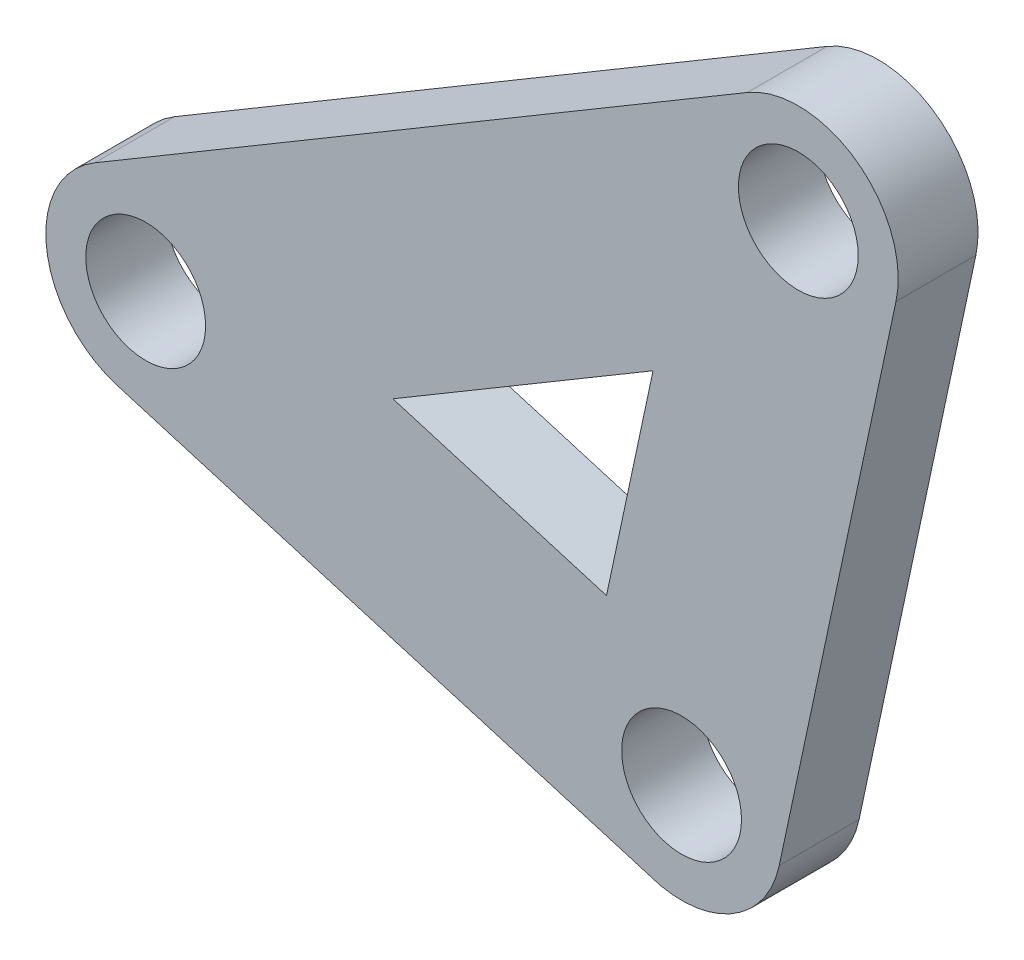
ISO-10303-21;
HEADER;
FILE_DESCRIPTION(('STEP AP214'),'2;1');
FILE_NAME('part.step','',(''),(''),'','','');
FILE_SCHEMA(('AUTOMOTIVE_DESIGN { 1 0 10303 214 1 1 1 1 }'));
ENDSEC;
DATA;
#1=APPLICATION_CONTEXT('core data for automotive mechanical design processes');
#2=APPLICATION_PROTOCOL_DEFINITION('international standard','automotive_design',2000,#1);
#3=PRODUCT_CONTEXT('',#1,'mechanical');
#4=PRODUCT('Part','Part','',(#3));
#5=PRODUCT_RELATED_PRODUCT_CATEGORY('part','',(#4));
#6=PRODUCT_DEFINITION_FORMATION('','',#4);
#7=PRODUCT_DEFINITION_CONTEXT('part definition',#1,'design');
#8=PRODUCT_DEFINITION('design','',#6,#7);
#9=PRODUCT_DEFINITION_SHAPE('','',#8);
#10=(LENGTH_UNIT() NAMED_UNIT(*) SI_UNIT(.MILLI.,.METRE.));
#11=(NAMED_UNIT(*) PLANE_ANGLE_UNIT() SI_UNIT($,.RADIAN.));
#12=(NAMED_UNIT(*) SI_UNIT($,.STERADIAN.) SOLID_ANGLE_UNIT());
#13=UNCERTAINTY_MEASURE_WITH_UNIT(LENGTH_MEASURE(1.E-05),#10,'distance_accuracy_value','');
#14=(GEOMETRIC_REPRESENTATION_CONTEXT(3) GLOBAL_UNCERTAINTY_ASSIGNED_CONTEXT((#13)) GLOBAL_UNIT_ASSIGNED_CONTEXT((#10,
#11,#12)) REPRESENTATION_CONTEXT('',''));
#15=CARTESIAN_POINT('',(0.,0.,0.));
#16=DIRECTION('',(0.,0.,1.));
#17=DIRECTION('',(1.,0.,0.));
#18=AXIS2_PLACEMENT_3D('',#15,#16,#17);
#19=CARTESIAN_POINT('',(-17.5433301886553,3.74516692806603,-2.));
#20=DIRECTION('',(0.977963368191997,-0.208776556333713,0.));
#21=DIRECTION('',(0.208776556333713,0.977963368191997,0.));
#22=AXIS2_PLACEMENT_3D('',#19,#20,#21);
#23=PLANE('',#22);
#24=DIRECTION('',(0.208776556333713,0.977963368191997,0.));
#25=VECTOR('',#24,1.);
#26=CARTESIAN_POINT('',(-17.5433301886553,3.74516692806603,0.));
#27=LINE('',#26,#25);
#28=CARTESIAN_POINT('',(-17.8799215946043,2.16848575826948,0.));
#29=VERTEX_POINT('',#28);
#30=CARTESIAN_POINT('',(-16.7147865975456,7.62627932538128,0.));
#31=VERTEX_POINT('',#30);
#32=EDGE_CURVE('E159',#29,#31,#27,.T.);
#33=ORIENTED_EDGE('',*,*,#32,.T.);
#34=DIRECTION('',(0.,0.,1.));
#35=VECTOR('',#34,1.);
#36=CARTESIAN_POINT('',(-16.7147865975456,7.62627932538128,-2.));
#37=LINE('',#36,#35);
#38=CARTESIAN_POINT('',(-16.7147865975456,7.62627932538128,-2.));
#39=VERTEX_POINT('',#38);
#40=EDGE_CURVE('E11',#39,#31,#37,.T.);
#41=ORIENTED_EDGE('',*,*,#40,.F.);
#42=DIRECTION('',(0.208776556333713,0.977963368191997,0.));
#43=VECTOR('',#42,1.);
#44=CARTESIAN_POINT('',(-17.5433301886553,3.74516692806603,-2.));
#45=LINE('',#44,#43);
#46=CARTESIAN_POINT('',(-17.8799215946043,2.16848575826948,-2.));
#47=VERTEX_POINT('',#46);
#48=EDGE_CURVE('E120',#47,#39,#45,.T.);
#49=ORIENTED_EDGE('',*,*,#48,.F.);
#50=DIRECTION('',(0.,0.,1.));
#51=VECTOR('',#50,1.);
#52=CARTESIAN_POINT('',(-17.8799215946043,2.16848575826948,-2.));
#53=LINE('',#52,#51);
#54=EDGE_CURVE('E125',#47,#29,#53,.T.);
#55=ORIENTED_EDGE('',*,*,#54,.T.);
#56=EDGE_LOOP('',(#33,#41,#49,#55));
#57=FACE_BOUND('',#56,.T.);
#58=ADVANCED_FACE('F39',(#57),#23,.F.);
#59=CARTESIAN_POINT('',(-7.6987142658417,12.9756829105631,-2.));
#60=DIRECTION('',(-0.510264432821165,0.860017562958859,0.));
#61=DIRECTION('',(-0.860017562958859,-0.510264432821165,0.));
#62=AXIS2_PLACEMENT_3D('',#59,#60,#61);
#63=PLANE('',#62);
#64=DIRECTION('',(-0.860017562958859,-0.510264432821165,0.));
#65=VECTOR('',#64,1.);
#66=CARTESIAN_POINT('',(-7.6987142658417,12.9756829105631,0.));
#67=LINE('',#66,#65);
#68=CARTESIAN_POINT('',(-23.2284813572229,3.76158294559823,0.));
#69=VERTEX_POINT('',#68);
#70=EDGE_CURVE('E86',#31,#69,#67,.T.);
#71=ORIENTED_EDGE('',*,*,#70,.T.);
#72=DIRECTION('',(0.,0.,1.));
#73=VECTOR('',#72,1.);
#74=CARTESIAN_POINT('',(-23.2284813572229,3.76158294559823,-2.));
#75=LINE('',#74,#73);
#76=CARTESIAN_POINT('',(-23.2284813572229,3.76158294559823,-2.));
#77=VERTEX_POINT('',#76);
#78=EDGE_CURVE('E49',#77,#69,#75,.T.);
#79=ORIENTED_EDGE('',*,*,#78,.F.);
#80=DIRECTION('',(-0.860017562958859,-0.510264432821165,0.));
#81=VECTOR('',#80,1.);
#82=CARTESIAN_POINT('',(-7.6987142658417,12.9756829105631,-2.));
#83=LINE('',#82,#81);
#84=EDGE_CURVE('E57',#39,#77,#83,.T.);
#85=ORIENTED_EDGE('',*,*,#84,.F.);
#86=ORIENTED_EDGE('',*,*,#40,.T.);
#87=EDGE_LOOP('',(#71,#79,#85,#86));
#88=FACE_BOUND('',#87,.T.);
#89=ADVANCED_FACE('F217',(#88),#63,.F.);
#90=CARTESIAN_POINT('',(-2.28224422330199,-7.6777304514016,-2.));
#91=DIRECTION('',(-0.284933068933284,-0.958547414700108,0.));
#92=DIRECTION('',(0.958547414700108,-0.284933068933284,0.));
#93=AXIS2_PLACEMENT_3D('',#90,#91,#92);
#94=PLANE('',#93);
#95=DIRECTION('',(0.958547414700108,-0.284933068933284,0.));
#96=VECTOR('',#95,1.);
#97=CARTESIAN_POINT('',(-2.28224422330199,-7.6777304514016,0.));
#98=LINE('',#97,#96);
#99=CARTESIAN_POINT('',(-30.1311160023831,0.600487590452555,0.));
#100=VERTEX_POINT('',#99);
#101=CARTESIAN_POINT('',(-16.5219413908343,-3.44490842048,0.));
#102=VERTEX_POINT('',#101);
#103=EDGE_CURVE('E140',#100,#102,#98,.T.);
#104=ORIENTED_EDGE('',*,*,#103,.F.);
#105=DIRECTION('',(0.,0.,1.));
#106=VECTOR('',#105,1.);
#107=CARTESIAN_POINT('',(-30.1311160023831,0.600487590452555,-2.));
#108=LINE('',#107,#106);
#109=CARTESIAN_POINT('',(-30.1311160023831,0.600487590452555,-2.));
#110=VERTEX_POINT('',#109);
#111=EDGE_CURVE('E130',#110,#100,#108,.T.);
#112=ORIENTED_EDGE('',*,*,#111,.F.);
#113=DIRECTION('',(0.958547414700108,-0.284933068933284,0.));
#114=VECTOR('',#113,1.);
#115=CARTESIAN_POINT('',(-2.28224422330199,-7.6777304514016,-2.));
#116=LINE('',#115,#114);
#117=CARTESIAN_POINT('',(-16.5219413908343,-3.44490842048,-2.));
#118=VERTEX_POINT('',#117);
#119=EDGE_CURVE('E162',#110,#118,#116,.T.);
#120=ORIENTED_EDGE('',*,*,#119,.T.);
#121=DIRECTION('',(0.,0.,1.));
#122=VECTOR('',#121,1.);
#123=CARTESIAN_POINT('',(-16.5219413908343,-3.44490842048,-2.));
#124=LINE('',#123,#122);
#125=EDGE_CURVE('E43',#118,#102,#124,.T.);
#126=ORIENTED_EDGE('',*,*,#125,.T.);
#127=EDGE_LOOP('',(#104,#112,#120,#126));
#128=FACE_BOUND('',#127,.T.);
#129=ADVANCED_FACE('F41',(#128),#94,.T.);
#130=CARTESIAN_POINT('',(-29.4174619075463,2.99646293108583,-2.));
#131=DIRECTION('',(0.,0.,1.));
#132=DIRECTION('',(1.,0.,0.));
#133=AXIS2_PLACEMENT_3D('',#130,#131,#132);
#134=CYLINDRICAL_SURFACE('',#133,2.5);
#135=CARTESIAN_POINT('',(-29.4174619075463,2.99646293108583,0.));
#136=DIRECTION('',(0.,0.,1.));
#137=DIRECTION('',(1.,0.,0.));
#138=AXIS2_PLACEMENT_3D('',#135,#136,#137);
#139=CIRCLE('',#138,2.5);
#140=CARTESIAN_POINT('',(-30.6931229895992,5.14650683848299,0.));
#141=VERTEX_POINT('',#140);
#142=EDGE_CURVE('E156',#141,#100,#139,.T.);
#143=ORIENTED_EDGE('',*,*,#142,.F.);
#144=DIRECTION('',(0.,0.,1.));
#145=VECTOR('',#144,1.);
#146=CARTESIAN_POINT('',(-30.6931229895992,5.14650683848299,-2.));
#147=LINE('',#146,#145);
#148=CARTESIAN_POINT('',(-30.6931229895992,5.14650683848299,-2.));
#149=VERTEX_POINT('',#148);
#150=EDGE_CURVE('E166',#149,#141,#147,.T.);
#151=ORIENTED_EDGE('',*,*,#150,.F.);
#152=CARTESIAN_POINT('',(-29.4174619075463,2.99646293108583,-2.));
#153=DIRECTION('',(0.,0.,1.));
#154=DIRECTION('',(1.,0.,0.));
#155=AXIS2_PLACEMENT_3D('',#152,#153,#154);
#156=CIRCLE('',#155,2.5);
#157=EDGE_CURVE('E132',#149,#110,#156,.T.);
#158=ORIENTED_EDGE('',*,*,#157,.T.);
#159=ORIENTED_EDGE('',*,*,#111,.T.);
#160=EDGE_LOOP('',(#143,#151,#158,#159));
#161=FACE_BOUND('',#160,.T.);
#162=ADVANCED_FACE('F183',(#161),#134,.T.);
#163=CARTESIAN_POINT('',(-10.2500364299475,17.2757707253574,-2.));
#164=DIRECTION('',(-0.510264432821165,0.860017562958859,0.));
#165=DIRECTION('',(-0.860017562958859,-0.510264432821165,0.));
#166=AXIS2_PLACEMENT_3D('',#163,#164,#165);
#167=PLANE('',#166);
#168=DIRECTION('',(-0.860017562958859,-0.510264432821165,0.));
#169=VECTOR('',#168,1.);
#170=CARTESIAN_POINT('',(-10.2500364299475,17.2757707253574,0.));
#171=LINE('',#170,#169);
#172=CARTESIAN_POINT('',(-14.3527892933809,14.8415310620851,0.));
#173=VERTEX_POINT('',#172);
#174=EDGE_CURVE('E153',#173,#141,#171,.T.);
#175=ORIENTED_EDGE('',*,*,#174,.F.);
#176=DIRECTION('',(0.,0.,1.));
#177=VECTOR('',#176,1.);
#178=CARTESIAN_POINT('',(-14.3527892933809,14.8415310620851,-2.));
#179=LINE('',#178,#177);
#180=CARTESIAN_POINT('',(-14.3527892933809,14.8415310620851,-2.));
#181=VERTEX_POINT('',#180);
#182=EDGE_CURVE('E168',#181,#173,#179,.T.);
#183=ORIENTED_EDGE('',*,*,#182,.F.);
#184=DIRECTION('',(-0.860017562958859,-0.510264432821165,0.));
#185=VECTOR('',#184,1.);
#186=CARTESIAN_POINT('',(-10.2500364299475,17.2757707253574,-2.));
#187=LINE('',#186,#185);
#188=EDGE_CURVE('E135',#181,#149,#187,.T.);
#189=ORIENTED_EDGE('',*,*,#188,.T.);
#190=ORIENTED_EDGE('',*,*,#150,.T.);
#191=EDGE_LOOP('',(#175,#183,#189,#190));
#192=FACE_BOUND('',#191,.T.);
#193=ADVANCED_FACE('F202',(#192),#167,.T.);
#194=CARTESIAN_POINT('',(-13.077128211328,12.691487154688,-2.));
#195=DIRECTION('',(0.,0.,1.));
#196=DIRECTION('',(1.,0.,0.));
#197=AXIS2_PLACEMENT_3D('',#194,#195,#196);
#198=CYLINDRICAL_SURFACE('',#197,2.5);
#199=CARTESIAN_POINT('',(-13.077128211328,12.691487154688,0.));
#200=DIRECTION('',(0.,0.,1.));
#201=DIRECTION('',(1.,0.,0.));
#202=AXIS2_PLACEMENT_3D('',#199,#200,#201);
#203=CIRCLE('',#202,2.5);
#204=CARTESIAN_POINT('',(-10.632219790848,12.1695457638537,0.));
#205=VERTEX_POINT('',#204);
#206=EDGE_CURVE('E150',#205,#173,#203,.T.);
#207=ORIENTED_EDGE('',*,*,#206,.F.);
#208=DIRECTION('',(0.,0.,1.));
#209=VECTOR('',#208,1.);
#210=CARTESIAN_POINT('',(-10.632219790848,12.1695457638537,-2.));
#211=LINE('',#210,#209);
#212=CARTESIAN_POINT('',(-10.632219790848,12.1695457638537,-2.));
#213=VERTEX_POINT('',#212);
#214=EDGE_CURVE('E170',#213,#205,#211,.T.);
#215=ORIENTED_EDGE('',*,*,#214,.F.);
#216=CARTESIAN_POINT('',(-13.077128211328,12.691487154688,-2.));
#217=DIRECTION('',(0.,0.,1.));
#218=DIRECTION('',(1.,0.,0.));
#219=AXIS2_PLACEMENT_3D('',#216,#217,#218);
#220=CIRCLE('',#219,2.5);
#221=EDGE_CURVE('E199',#213,#181,#220,.T.);
#222=ORIENTED_EDGE('',*,*,#221,.T.);
#223=ORIENTED_EDGE('',*,*,#182,.T.);
#224=EDGE_LOOP('',(#207,#215,#222,#223));
#225=FACE_BOUND('',#224,.T.);
#226=ADVANCED_FACE('F206',(#225),#198,.T.);
#227=CARTESIAN_POINT('',(-12.6535133476953,2.70128414639748,-2.));
#228=DIRECTION('',(0.977963368191997,-0.208776556333714,0.));
#229=DIRECTION('',(0.208776556333714,0.977963368191997,0.));
#230=AXIS2_PLACEMENT_3D('',#227,#228,#229);
#231=PLANE('',#230);
#232=DIRECTION('',(0.208776556333714,0.977963368191997,0.));
#233=VECTOR('',#232,1.);
#234=CARTESIAN_POINT('',(-12.6535133476953,2.70128414639748,0.));
#235=LINE('',#234,#233);
#236=CARTESIAN_POINT('',(-13.55509157952,-1.52194139083429,0.));
#237=VERTEX_POINT('',#236);
#238=EDGE_CURVE('E147',#237,#205,#235,.T.);
#239=ORIENTED_EDGE('',*,*,#238,.F.);
#240=DIRECTION('',(0.,0.,1.));
#241=VECTOR('',#240,1.);
#242=CARTESIAN_POINT('',(-13.55509157952,-1.52194139083429,-2.));
#243=LINE('',#242,#241);
#244=CARTESIAN_POINT('',(-13.55509157952,-1.52194139083429,-2.));
#245=VERTEX_POINT('',#244);
#246=EDGE_CURVE('E171',#245,#237,#243,.T.);
#247=ORIENTED_EDGE('',*,*,#246,.F.);
#248=DIRECTION('',(0.208776556333714,0.977963368191997,0.));
#249=VECTOR('',#248,1.);
#250=CARTESIAN_POINT('',(-12.6535133476953,2.70128414639748,-2.));
#251=LINE('',#250,#249);
#252=EDGE_CURVE('E191',#245,#213,#251,.T.);
#253=ORIENTED_EDGE('',*,*,#252,.T.);
#254=ORIENTED_EDGE('',*,*,#214,.T.);
#255=EDGE_LOOP('',(#239,#247,#253,#254));
#256=FACE_BOUND('',#255,.T.);
#257=ADVANCED_FACE('F208',(#256),#231,.T.);
#258=CARTESIAN_POINT('',(-16.,-1.,-2.));
#259=DIRECTION('',(0.,0.,1.));
#260=DIRECTION('',(1.,0.,0.));
#261=AXIS2_PLACEMENT_3D('',#258,#259,#260);
#262=CYLINDRICAL_SURFACE('',#261,2.5);
#263=CARTESIAN_POINT('',(-16.,-1.,0.));
#264=DIRECTION('',(0.,0.,1.));
#265=DIRECTION('',(1.,0.,0.));
#266=AXIS2_PLACEMENT_3D('',#263,#264,#265);
#267=CIRCLE('',#266,2.5);
#268=EDGE_CURVE('E143',#102,#237,#267,.T.);
#269=ORIENTED_EDGE('',*,*,#268,.F.);
#270=ORIENTED_EDGE('',*,*,#125,.F.);
#271=CARTESIAN_POINT('',(-16.,-1.,-2.));
#272=DIRECTION('',(0.,0.,1.));
#273=DIRECTION('',(1.,0.,0.));
#274=AXIS2_PLACEMENT_3D('',#271,#272,#273);
#275=CIRCLE('',#274,2.5);
#276=EDGE_CURVE('E189',#118,#245,#275,.T.);
#277=ORIENTED_EDGE('',*,*,#276,.T.);
#278=ORIENTED_EDGE('',*,*,#246,.T.);
#279=EDGE_LOOP('',(#269,#270,#277,#278));
#280=FACE_BOUND('',#279,.T.);
#281=ADVANCED_FACE('F177',(#280),#262,.T.);
#282=CARTESIAN_POINT('',(-0.863743070956386,-2.89987420183968,-2.));
#283=DIRECTION('',(-0.285461637934702,-0.958390136253309,0.));
#284=DIRECTION('',(0.958390136253309,-0.285461637934702,0.));
#285=AXIS2_PLACEMENT_3D('',#282,#283,#284);
#286=PLANE('',#285);
#287=DIRECTION('',(0.958390136253309,-0.285461637934702,0.));
#288=VECTOR('',#287,1.);
#289=CARTESIAN_POINT('',(-0.863743070956386,-2.89987420183968,0.));
#290=LINE('',#289,#288);
#291=EDGE_CURVE('E127',#69,#29,#290,.T.);
#292=ORIENTED_EDGE('',*,*,#291,.T.);
#293=ORIENTED_EDGE('',*,*,#54,.F.);
#294=DIRECTION('',(0.958390136253309,-0.285461637934702,0.));
#295=VECTOR('',#294,1.);
#296=CARTESIAN_POINT('',(-0.863743070956386,-2.89987420183968,-2.));
#297=LINE('',#296,#295);
#298=EDGE_CURVE('E116',#77,#47,#297,.T.);
#299=ORIENTED_EDGE('',*,*,#298,.F.);
#300=ORIENTED_EDGE('',*,*,#78,.T.);
#301=EDGE_LOOP('',(#292,#293,#299,#300));
#302=FACE_BOUND('',#301,.T.);
#303=ADVANCED_FACE('F126',(#302),#286,.F.);
#304=CARTESIAN_POINT('',(0.,0.,-2.));
#305=DIRECTION('',(0.,0.,1.));
#306=DIRECTION('',(1.,0.,0.));
#307=AXIS2_PLACEMENT_3D('',#304,#305,#306);
#308=PLANE('',#307);
#309=CARTESIAN_POINT('',(-29.4174619075463,2.99646293108583,-2.));
#310=DIRECTION('',(0.,0.,1.));
#311=DIRECTION('',(1.,0.,0.));
#312=AXIS2_PLACEMENT_3D('',#309,#310,#311);
#313=CIRCLE('',#312,1.5);
#314=CARTESIAN_POINT('',(-27.9174619075463,2.99646293108583,-2.));
#315=VERTEX_POINT('',#314);
#316=EDGE_CURVE('E144',#315,#315,#313,.T.);
#317=ORIENTED_EDGE('',*,*,#316,.T.);
#318=EDGE_LOOP('',(#317));
#319=FACE_BOUND('',#318,.T.);
#320=CARTESIAN_POINT('',(-16.,-1.,-2.));
#321=DIRECTION('',(0.,0.,1.));
#322=DIRECTION('',(1.,0.,0.));
#323=AXIS2_PLACEMENT_3D('',#320,#321,#322);
#324=CIRCLE('',#323,1.5);
#325=CARTESIAN_POINT('',(-14.5,-1.,-2.));
#326=VERTEX_POINT('',#325);
#327=EDGE_CURVE('E420',#326,#326,#324,.T.);
#328=ORIENTED_EDGE('',*,*,#327,.T.);
#329=EDGE_LOOP('',(#328));
#330=FACE_BOUND('',#329,.T.);
#331=CARTESIAN_POINT('',(-13.077128211328,12.691487154688,-2.));
#332=DIRECTION('',(0.,0.,1.));
#333=DIRECTION('',(1.,0.,0.));
#334=AXIS2_PLACEMENT_3D('',#331,#332,#333);
#335=CIRCLE('',#334,1.5);
#336=CARTESIAN_POINT('',(-11.577128211328,12.691487154688,-2.));
#337=VERTEX_POINT('',#336);
#338=EDGE_CURVE('E194',#337,#337,#335,.T.);
#339=ORIENTED_EDGE('',*,*,#338,.T.);
#340=EDGE_LOOP('',(#339));
#341=FACE_BOUND('',#340,.T.);
#342=ORIENTED_EDGE('',*,*,#119,.F.);
#343=ORIENTED_EDGE('',*,*,#157,.F.);
#344=ORIENTED_EDGE('',*,*,#188,.F.);
#345=ORIENTED_EDGE('',*,*,#221,.F.);
#346=ORIENTED_EDGE('',*,*,#252,.F.);
#347=ORIENTED_EDGE('',*,*,#276,.F.);
#348=EDGE_LOOP('',(#342,#343,#344,#345,#346,#347));
#349=FACE_BOUND('',#348,.T.);
#350=ORIENTED_EDGE('',*,*,#48,.T.);
#351=ORIENTED_EDGE('',*,*,#84,.T.);
#352=ORIENTED_EDGE('',*,*,#298,.T.);
#353=EDGE_LOOP('',(#350,#351,#352));
#354=FACE_BOUND('',#353,.T.);
#355=ADVANCED_FACE('F118',(#319,#330,#341,#349,#354),#308,.F.);
#356=CARTESIAN_POINT('',(0.,0.,0.));
#357=DIRECTION('',(0.,0.,1.));
#358=DIRECTION('',(1.,0.,0.));
#359=AXIS2_PLACEMENT_3D('',#356,#357,#358);
#360=PLANE('',#359);
#361=CARTESIAN_POINT('',(-29.4174619075463,2.99646293108583,0.));
#362=DIRECTION('',(0.,0.,1.));
#363=DIRECTION('',(1.,0.,0.));
#364=AXIS2_PLACEMENT_3D('',#361,#362,#363);
#365=CIRCLE('',#364,1.5);
#366=CARTESIAN_POINT('',(-27.9174619075463,2.99646293108583,0.));
#367=VERTEX_POINT('',#366);
#368=EDGE_CURVE('E415',#367,#367,#365,.T.);
#369=ORIENTED_EDGE('',*,*,#368,.F.);
#370=EDGE_LOOP('',(#369));
#371=FACE_BOUND('',#370,.T.);
#372=CARTESIAN_POINT('',(-16.,-1.,0.));
#373=DIRECTION('',(0.,0.,1.));
#374=DIRECTION('',(1.,0.,0.));
#375=AXIS2_PLACEMENT_3D('',#372,#373,#374);
#376=CIRCLE('',#375,1.5);
#377=CARTESIAN_POINT('',(-14.5,-1.,0.));
#378=VERTEX_POINT('',#377);
#379=EDGE_CURVE('E416',#378,#378,#376,.T.);
#380=ORIENTED_EDGE('',*,*,#379,.F.);
#381=EDGE_LOOP('',(#380));
#382=FACE_BOUND('',#381,.T.);
#383=CARTESIAN_POINT('',(-13.077128211328,12.691487154688,0.));
#384=DIRECTION('',(0.,0.,1.));
#385=DIRECTION('',(1.,0.,0.));
#386=AXIS2_PLACEMENT_3D('',#383,#384,#385);
#387=CIRCLE('',#386,1.5);
#388=CARTESIAN_POINT('',(-11.577128211328,12.691487154688,0.));
#389=VERTEX_POINT('',#388);
#390=EDGE_CURVE('E424',#389,#389,#387,.T.);
#391=ORIENTED_EDGE('',*,*,#390,.F.);
#392=EDGE_LOOP('',(#391));
#393=FACE_BOUND('',#392,.T.);
#394=ORIENTED_EDGE('',*,*,#103,.T.);
#395=ORIENTED_EDGE('',*,*,#268,.T.);
#396=ORIENTED_EDGE('',*,*,#238,.T.);
#397=ORIENTED_EDGE('',*,*,#206,.T.);
#398=ORIENTED_EDGE('',*,*,#174,.T.);
#399=ORIENTED_EDGE('',*,*,#142,.T.);
#400=EDGE_LOOP('',(#394,#395,#396,#397,#398,#399));
#401=FACE_BOUND('',#400,.T.);
#402=ORIENTED_EDGE('',*,*,#32,.F.);
#403=ORIENTED_EDGE('',*,*,#291,.F.);
#404=ORIENTED_EDGE('',*,*,#70,.F.);
#405=EDGE_LOOP('',(#402,#403,#404));
#406=FACE_BOUND('',#405,.T.);
#407=ADVANCED_FACE('F179',(#371,#382,#393,#401,#406),#360,.T.);
#408=CARTESIAN_POINT('',(-13.077128211328,12.691487154688,-2.));
#409=DIRECTION('',(0.,0.,1.));
#410=DIRECTION('',(1.,0.,0.));
#411=AXIS2_PLACEMENT_3D('',#408,#409,#410);
#412=CYLINDRICAL_SURFACE('',#411,1.5);
#413=ORIENTED_EDGE('',*,*,#338,.F.);
#414=EDGE_LOOP('',(#413));
#415=FACE_BOUND('',#414,.T.);
#416=ORIENTED_EDGE('',*,*,#390,.T.);
#417=EDGE_LOOP('',(#416));
#418=FACE_BOUND('',#417,.T.);
#419=ADVANCED_FACE('F279',(#415,#418),#412,.F.);
#420=CARTESIAN_POINT('',(-16.,-1.,-2.));
#421=DIRECTION('',(0.,0.,1.));
#422=DIRECTION('',(1.,0.,0.));
#423=AXIS2_PLACEMENT_3D('',#420,#421,#422);
#424=CYLINDRICAL_SURFACE('',#423,1.5);
#425=ORIENTED_EDGE('',*,*,#327,.F.);
#426=EDGE_LOOP('',(#425));
#427=FACE_BOUND('',#426,.T.);
#428=ORIENTED_EDGE('',*,*,#379,.T.);
#429=EDGE_LOOP('',(#428));
#430=FACE_BOUND('',#429,.T.);
#431=ADVANCED_FACE('F290',(#427,#430),#424,.F.);
#432=CARTESIAN_POINT('',(-29.4174619075463,2.99646293108583,-2.));
#433=DIRECTION('',(0.,0.,1.));
#434=DIRECTION('',(1.,0.,0.));
#435=AXIS2_PLACEMENT_3D('',#432,#433,#434);
#436=CYLINDRICAL_SURFACE('',#435,1.5);
#437=ORIENTED_EDGE('',*,*,#316,.F.);
#438=EDGE_LOOP('',(#437));
#439=FACE_BOUND('',#438,.T.);
#440=ORIENTED_EDGE('',*,*,#368,.T.);
#441=EDGE_LOOP('',(#440));
#442=FACE_BOUND('',#441,.T.);
#443=ADVANCED_FACE('F301',(#439,#442),#436,.F.);
#444=CLOSED_SHELL('',(#58,#89,#129,#162,#193,#226,#257,#281,#303,#355,#407,#419,#431,#443));
#445=MANIFOLD_SOLID_BREP('B2',#444);
#446=ADVANCED_BREP_SHAPE_REPRESENTATION('',(#18,#445),#14);
#447=SHAPE_DEFINITION_REPRESENTATION(#9,#446);
ENDSEC;
END-ISO-10303-21;
